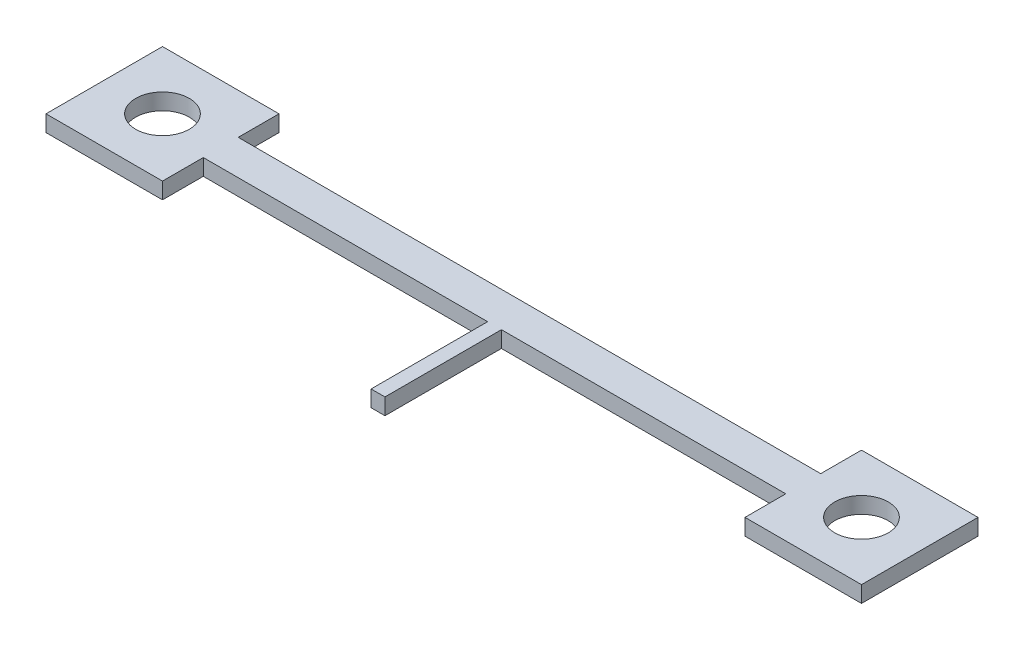
ISO-10303-21;
HEADER;
FILE_DESCRIPTION(('STEP AP214'),'2;1');
FILE_NAME('part.step','',(''),(''),'','','');
FILE_SCHEMA(('AUTOMOTIVE_DESIGN { 1 0 10303 214 1 1 1 1 }'));
ENDSEC;
DATA;
#1=APPLICATION_CONTEXT('core data for automotive mechanical design processes');
#2=APPLICATION_PROTOCOL_DEFINITION('international standard','automotive_design',2000,#1);
#3=PRODUCT_CONTEXT('',#1,'mechanical');
#4=PRODUCT('Part','Part','',(#3));
#5=PRODUCT_RELATED_PRODUCT_CATEGORY('part','',(#4));
#6=PRODUCT_DEFINITION_FORMATION('','',#4);
#7=PRODUCT_DEFINITION_CONTEXT('part definition',#1,'design');
#8=PRODUCT_DEFINITION('design','',#6,#7);
#9=PRODUCT_DEFINITION_SHAPE('','',#8);
#10=(LENGTH_UNIT() NAMED_UNIT(*) SI_UNIT(.MILLI.,.METRE.));
#11=(NAMED_UNIT(*) PLANE_ANGLE_UNIT() SI_UNIT($,.RADIAN.));
#12=(NAMED_UNIT(*) SI_UNIT($,.STERADIAN.) SOLID_ANGLE_UNIT());
#13=UNCERTAINTY_MEASURE_WITH_UNIT(LENGTH_MEASURE(1.E-05),#10,'distance_accuracy_value','');
#14=(GEOMETRIC_REPRESENTATION_CONTEXT(3) GLOBAL_UNCERTAINTY_ASSIGNED_CONTEXT((#13)) GLOBAL_UNIT_ASSIGNED_CONTEXT((#10,
#11,#12)) REPRESENTATION_CONTEXT('',''));
#15=CARTESIAN_POINT('',(0.,0.,0.));
#16=DIRECTION('',(0.,0.,1.));
#17=DIRECTION('',(1.,0.,0.));
#18=AXIS2_PLACEMENT_3D('',#15,#16,#17);
#19=CARTESIAN_POINT('',(-41.4240464845624,0.4445,10.2832594653076));
#20=DIRECTION('',(0.,0.,-1.));
#21=DIRECTION('',(-1.,0.,0.));
#22=AXIS2_PLACEMENT_3D('',#19,#20,#21);
#23=PLANE('',#22);
#24=DIRECTION('',(0.,1.,0.));
#25=VECTOR('',#24,1.);
#26=CARTESIAN_POINT('',(-25.1720464765624,0.4445,10.2832594653076));
#27=LINE('',#26,#25);
#28=CARTESIAN_POINT('',(-25.1720464765624,-0.444499999999999,10.2832594653076));
#29=VERTEX_POINT('',#28);
#30=CARTESIAN_POINT('',(-25.1720464765624,0.4445,10.2832594653076));
#31=VERTEX_POINT('',#30);
#32=EDGE_CURVE('E499',#29,#31,#27,.T.);
#33=ORIENTED_EDGE('',*,*,#32,.F.);
#34=DIRECTION('',(1.,0.,0.));
#35=VECTOR('',#34,1.);
#36=CARTESIAN_POINT('',(-41.4240464845624,-0.4445,10.2832594653076));
#37=LINE('',#36,#35);
#38=CARTESIAN_POINT('',(-9.67404648456241,-0.4445,10.2832594653076));
#39=VERTEX_POINT('',#38);
#40=EDGE_CURVE('E181',#29,#39,#37,.T.);
#41=ORIENTED_EDGE('',*,*,#40,.T.);
#42=DIRECTION('',(0.,-1.,0.));
#43=VECTOR('',#42,1.);
#44=CARTESIAN_POINT('',(-9.67404648456241,0.4445,10.2832594653076));
#45=LINE('',#44,#43);
#46=CARTESIAN_POINT('',(-9.67404648456241,0.4445,10.2832594653076));
#47=VERTEX_POINT('',#46);
#48=EDGE_CURVE('E154',#47,#39,#45,.T.);
#49=ORIENTED_EDGE('',*,*,#48,.F.);
#50=DIRECTION('',(1.,0.,0.));
#51=VECTOR('',#50,1.);
#52=CARTESIAN_POINT('',(-41.4240464845624,0.4445,10.2832594653076));
#53=LINE('',#52,#51);
#54=EDGE_CURVE('E144',#31,#47,#53,.T.);
#55=ORIENTED_EDGE('',*,*,#54,.F.);
#56=EDGE_LOOP('',(#33,#41,#49,#55));
#57=FACE_BOUND('',#56,.T.);
#58=ADVANCED_FACE('F36',(#57),#23,.F.);
#59=CARTESIAN_POINT('',(-41.4240464845624,-0.4445,10.2832594653076));
#60=VERTEX_POINT('',#59);
#61=CARTESIAN_POINT('',(-25.9260464925624,-0.4445,10.2832594653076));
#62=VERTEX_POINT('',#61);
#63=EDGE_CURVE('E182',#60,#62,#37,.T.);
#64=ORIENTED_EDGE('',*,*,#63,.T.);
#65=DIRECTION('',(0.,-1.,0.));
#66=VECTOR('',#65,1.);
#67=CARTESIAN_POINT('',(-25.9260464925624,0.4445,10.2832594653076));
#68=LINE('',#67,#66);
#69=CARTESIAN_POINT('',(-25.9260464925624,0.4445,10.2832594653076));
#70=VERTEX_POINT('',#69);
#71=EDGE_CURVE('E258',#70,#62,#68,.T.);
#72=ORIENTED_EDGE('',*,*,#71,.F.);
#73=CARTESIAN_POINT('',(-41.4240464845624,0.4445,10.2832594653076));
#74=VERTEX_POINT('',#73);
#75=EDGE_CURVE('E148',#74,#70,#53,.T.);
#76=ORIENTED_EDGE('',*,*,#75,.F.);
#77=DIRECTION('',(0.,-1.,0.));
#78=VECTOR('',#77,1.);
#79=CARTESIAN_POINT('',(-41.4240464845624,0.4445,10.2832594653076));
#80=LINE('',#79,#78);
#81=EDGE_CURVE('E192',#74,#60,#80,.T.);
#82=ORIENTED_EDGE('',*,*,#81,.T.);
#83=EDGE_LOOP('',(#64,#72,#76,#82));
#84=FACE_BOUND('',#83,.T.);
#85=ADVANCED_FACE('F255',(#84),#23,.F.);
#86=CARTESIAN_POINT('',(-9.67404648456241,0.4445,6.15575946530759));
#87=DIRECTION('',(0.,0.,1.));
#88=DIRECTION('',(1.,0.,0.));
#89=AXIS2_PLACEMENT_3D('',#86,#87,#88);
#90=PLANE('',#89);
#91=DIRECTION('',(-1.,0.,0.));
#92=VECTOR('',#91,1.);
#93=CARTESIAN_POINT('',(-9.67404648456241,-0.4445,6.15575946530759));
#94=LINE('',#93,#92);
#95=CARTESIAN_POINT('',(-3.32404648456241,-0.4445,6.15575946530759));
#96=VERTEX_POINT('',#95);
#97=CARTESIAN_POINT('',(-9.67404648456241,-0.4445,6.15575946530759));
#98=VERTEX_POINT('',#97);
#99=EDGE_CURVE('E163',#96,#98,#94,.T.);
#100=ORIENTED_EDGE('',*,*,#99,.T.);
#101=DIRECTION('',(0.,-1.,0.));
#102=VECTOR('',#101,1.);
#103=CARTESIAN_POINT('',(-9.67404648456241,0.4445,6.15575946530759));
#104=LINE('',#103,#102);
#105=CARTESIAN_POINT('',(-9.67404648456241,0.4445,6.15575946530759));
#106=VERTEX_POINT('',#105);
#107=EDGE_CURVE('E11',#106,#98,#104,.T.);
#108=ORIENTED_EDGE('',*,*,#107,.F.);
#109=DIRECTION('',(-1.,0.,0.));
#110=VECTOR('',#109,1.);
#111=CARTESIAN_POINT('',(-9.67404648456241,0.4445,6.15575946530759));
#112=LINE('',#111,#110);
#113=CARTESIAN_POINT('',(-3.32404648456241,0.4445,6.15575946530759));
#114=VERTEX_POINT('',#113);
#115=EDGE_CURVE('E188',#114,#106,#112,.T.);
#116=ORIENTED_EDGE('',*,*,#115,.F.);
#117=DIRECTION('',(0.,-1.,0.));
#118=VECTOR('',#117,1.);
#119=CARTESIAN_POINT('',(-3.32404648456241,0.4445,6.15575946530759));
#120=LINE('',#119,#118);
#121=EDGE_CURVE('E159',#114,#96,#120,.T.);
#122=ORIENTED_EDGE('',*,*,#121,.T.);
#123=EDGE_LOOP('',(#100,#108,#116,#122));
#124=FACE_BOUND('',#123,.T.);
#125=ADVANCED_FACE('F38',(#124),#90,.F.);
#126=CARTESIAN_POINT('',(-9.67404648456241,0.4445,8.37825946530759));
#127=DIRECTION('',(1.,0.,0.));
#128=DIRECTION('',(0.,0.,-1.));
#129=AXIS2_PLACEMENT_3D('',#126,#127,#128);
#130=PLANE('',#129);
#131=DIRECTION('',(0.,0.,1.));
#132=VECTOR('',#131,1.);
#133=CARTESIAN_POINT('',(-9.67404648456241,-0.4445,8.37825946530759));
#134=LINE('',#133,#132);
#135=CARTESIAN_POINT('',(-9.67404648456241,-0.4445,8.37825946530759));
#136=VERTEX_POINT('',#135);
#137=EDGE_CURVE('E166',#98,#136,#134,.T.);
#138=ORIENTED_EDGE('',*,*,#137,.T.);
#139=DIRECTION('',(0.,-1.,0.));
#140=VECTOR('',#139,1.);
#141=CARTESIAN_POINT('',(-9.67404648456241,0.4445,8.37825946530759));
#142=LINE('',#141,#140);
#143=CARTESIAN_POINT('',(-9.67404648456241,0.4445,8.37825946530759));
#144=VERTEX_POINT('',#143);
#145=EDGE_CURVE('E45',#144,#136,#142,.T.);
#146=ORIENTED_EDGE('',*,*,#145,.F.);
#147=DIRECTION('',(0.,0.,1.));
#148=VECTOR('',#147,1.);
#149=CARTESIAN_POINT('',(-9.67404648456241,0.4445,8.37825946530759));
#150=LINE('',#149,#148);
#151=EDGE_CURVE('E109',#106,#144,#150,.T.);
#152=ORIENTED_EDGE('',*,*,#151,.F.);
#153=ORIENTED_EDGE('',*,*,#107,.T.);
#154=EDGE_LOOP('',(#138,#146,#152,#153));
#155=FACE_BOUND('',#154,.T.);
#156=ADVANCED_FACE('F296',(#155),#130,.F.);
#157=CARTESIAN_POINT('',(-41.4240464845624,0.4445,8.37825946530759));
#158=DIRECTION('',(0.,0.,1.));
#159=DIRECTION('',(1.,0.,0.));
#160=AXIS2_PLACEMENT_3D('',#157,#158,#159);
#161=PLANE('',#160);
#162=DIRECTION('',(-1.,0.,0.));
#163=VECTOR('',#162,1.);
#164=CARTESIAN_POINT('',(-41.4240464845624,-0.4445,8.37825946530759));
#165=LINE('',#164,#163);
#166=CARTESIAN_POINT('',(-41.4240464845624,-0.4445,8.37825946530759));
#167=VERTEX_POINT('',#166);
#168=EDGE_CURVE('E169',#136,#167,#165,.T.);
#169=ORIENTED_EDGE('',*,*,#168,.T.);
#170=DIRECTION('',(0.,-1.,0.));
#171=VECTOR('',#170,1.);
#172=CARTESIAN_POINT('',(-41.4240464845624,0.4445,8.37825946530759));
#173=LINE('',#172,#171);
#174=CARTESIAN_POINT('',(-41.4240464845624,0.4445,8.37825946530759));
#175=VERTEX_POINT('',#174);
#176=EDGE_CURVE('E207',#175,#167,#173,.T.);
#177=ORIENTED_EDGE('',*,*,#176,.F.);
#178=DIRECTION('',(-1.,0.,0.));
#179=VECTOR('',#178,1.);
#180=CARTESIAN_POINT('',(-41.4240464845624,0.4445,8.37825946530759));
#181=LINE('',#180,#179);
#182=EDGE_CURVE('E215',#144,#175,#181,.T.);
#183=ORIENTED_EDGE('',*,*,#182,.F.);
#184=ORIENTED_EDGE('',*,*,#145,.T.);
#185=EDGE_LOOP('',(#169,#177,#183,#184));
#186=FACE_BOUND('',#185,.T.);
#187=ADVANCED_FACE('F213',(#186),#161,.F.);
#188=CARTESIAN_POINT('',(-41.4240464845624,0.4445,8.37825946530759));
#189=DIRECTION('',(-1.,0.,0.));
#190=DIRECTION('',(0.,0.,1.));
#191=AXIS2_PLACEMENT_3D('',#188,#189,#190);
#192=PLANE('',#191);
#193=DIRECTION('',(0.,0.,-1.));
#194=VECTOR('',#193,1.);
#195=CARTESIAN_POINT('',(-41.4240464845624,-0.4445,8.37825946530759));
#196=LINE('',#195,#194);
#197=CARTESIAN_POINT('',(-41.4240464845624,-0.4445,6.15575946530758));
#198=VERTEX_POINT('',#197);
#199=EDGE_CURVE('E171',#167,#198,#196,.T.);
#200=ORIENTED_EDGE('',*,*,#199,.T.);
#201=DIRECTION('',(0.,-1.,0.));
#202=VECTOR('',#201,1.);
#203=CARTESIAN_POINT('',(-41.4240464845624,0.4445,6.15575946530758));
#204=LINE('',#203,#202);
#205=CARTESIAN_POINT('',(-41.4240464845624,0.4445,6.15575946530758));
#206=VERTEX_POINT('',#205);
#207=EDGE_CURVE('E204',#206,#198,#204,.T.);
#208=ORIENTED_EDGE('',*,*,#207,.F.);
#209=DIRECTION('',(0.,0.,-1.));
#210=VECTOR('',#209,1.);
#211=CARTESIAN_POINT('',(-41.4240464845624,0.4445,8.37825946530759));
#212=LINE('',#211,#210);
#213=EDGE_CURVE('E235',#175,#206,#212,.T.);
#214=ORIENTED_EDGE('',*,*,#213,.F.);
#215=ORIENTED_EDGE('',*,*,#176,.T.);
#216=EDGE_LOOP('',(#200,#208,#214,#215));
#217=FACE_BOUND('',#216,.T.);
#218=ADVANCED_FACE('F226',(#217),#192,.F.);
#219=CARTESIAN_POINT('',(-47.7740464845624,0.4445,6.15575946530758));
#220=DIRECTION('',(0.,0.,1.));
#221=DIRECTION('',(1.,0.,0.));
#222=AXIS2_PLACEMENT_3D('',#219,#220,#221);
#223=PLANE('',#222);
#224=DIRECTION('',(-1.,0.,0.));
#225=VECTOR('',#224,1.);
#226=CARTESIAN_POINT('',(-47.7740464845624,-0.4445,6.15575946530758));
#227=LINE('',#226,#225);
#228=CARTESIAN_POINT('',(-47.7740464845624,-0.4445,6.15575946530758));
#229=VERTEX_POINT('',#228);
#230=EDGE_CURVE('E173',#198,#229,#227,.T.);
#231=ORIENTED_EDGE('',*,*,#230,.T.);
#232=DIRECTION('',(0.,-1.,0.));
#233=VECTOR('',#232,1.);
#234=CARTESIAN_POINT('',(-47.7740464845624,0.4445,6.15575946530758));
#235=LINE('',#234,#233);
#236=CARTESIAN_POINT('',(-47.7740464845624,0.4445,6.15575946530758));
#237=VERTEX_POINT('',#236);
#238=EDGE_CURVE('E201',#237,#229,#235,.T.);
#239=ORIENTED_EDGE('',*,*,#238,.F.);
#240=DIRECTION('',(-1.,0.,0.));
#241=VECTOR('',#240,1.);
#242=CARTESIAN_POINT('',(-47.7740464845624,0.4445,6.15575946530758));
#243=LINE('',#242,#241);
#244=EDGE_CURVE('E232',#206,#237,#243,.T.);
#245=ORIENTED_EDGE('',*,*,#244,.F.);
#246=ORIENTED_EDGE('',*,*,#207,.T.);
#247=EDGE_LOOP('',(#231,#239,#245,#246));
#248=FACE_BOUND('',#247,.T.);
#249=ADVANCED_FACE('F230',(#248),#223,.F.);
#250=CARTESIAN_POINT('',(-47.7740464845624,0.4445,12.5057594653076));
#251=DIRECTION('',(1.,0.,0.));
#252=DIRECTION('',(0.,0.,-1.));
#253=AXIS2_PLACEMENT_3D('',#250,#251,#252);
#254=PLANE('',#253);
#255=DIRECTION('',(0.,0.,1.));
#256=VECTOR('',#255,1.);
#257=CARTESIAN_POINT('',(-47.7740464845624,-0.4445,12.5057594653076));
#258=LINE('',#257,#256);
#259=CARTESIAN_POINT('',(-47.7740464845624,-0.4445,12.5057594653076));
#260=VERTEX_POINT('',#259);
#261=EDGE_CURVE('E175',#229,#260,#258,.T.);
#262=ORIENTED_EDGE('',*,*,#261,.T.);
#263=DIRECTION('',(0.,-1.,0.));
#264=VECTOR('',#263,1.);
#265=CARTESIAN_POINT('',(-47.7740464845624,0.4445,12.5057594653076));
#266=LINE('',#265,#264);
#267=CARTESIAN_POINT('',(-47.7740464845624,0.4445,12.5057594653076));
#268=VERTEX_POINT('',#267);
#269=EDGE_CURVE('E198',#268,#260,#266,.T.);
#270=ORIENTED_EDGE('',*,*,#269,.F.);
#271=DIRECTION('',(0.,0.,1.));
#272=VECTOR('',#271,1.);
#273=CARTESIAN_POINT('',(-47.7740464845624,0.4445,12.5057594653076));
#274=LINE('',#273,#272);
#275=EDGE_CURVE('E234',#237,#268,#274,.T.);
#276=ORIENTED_EDGE('',*,*,#275,.F.);
#277=ORIENTED_EDGE('',*,*,#238,.T.);
#278=EDGE_LOOP('',(#262,#270,#276,#277));
#279=FACE_BOUND('',#278,.T.);
#280=ADVANCED_FACE('F320',(#279),#254,.F.);
#281=CARTESIAN_POINT('',(-47.7740464845624,0.4445,12.5057594653076));
#282=DIRECTION('',(0.,0.,-1.));
#283=DIRECTION('',(-1.,0.,0.));
#284=AXIS2_PLACEMENT_3D('',#281,#282,#283);
#285=PLANE('',#284);
#286=DIRECTION('',(1.,0.,0.));
#287=VECTOR('',#286,1.);
#288=CARTESIAN_POINT('',(-47.7740464845624,-0.4445,12.5057594653076));
#289=LINE('',#288,#287);
#290=CARTESIAN_POINT('',(-41.4240464845624,-0.4445,12.5057594653076));
#291=VERTEX_POINT('',#290);
#292=EDGE_CURVE('E177',#260,#291,#289,.T.);
#293=ORIENTED_EDGE('',*,*,#292,.T.);
#294=DIRECTION('',(0.,-1.,0.));
#295=VECTOR('',#294,1.);
#296=CARTESIAN_POINT('',(-41.4240464845624,0.4445,12.5057594653076));
#297=LINE('',#296,#295);
#298=CARTESIAN_POINT('',(-41.4240464845624,0.4445,12.5057594653076));
#299=VERTEX_POINT('',#298);
#300=EDGE_CURVE('E195',#299,#291,#297,.T.);
#301=ORIENTED_EDGE('',*,*,#300,.F.);
#302=DIRECTION('',(1.,0.,0.));
#303=VECTOR('',#302,1.);
#304=CARTESIAN_POINT('',(-47.7740464845624,0.4445,12.5057594653076));
#305=LINE('',#304,#303);
#306=EDGE_CURVE('E237',#268,#299,#305,.T.);
#307=ORIENTED_EDGE('',*,*,#306,.F.);
#308=ORIENTED_EDGE('',*,*,#269,.T.);
#309=EDGE_LOOP('',(#293,#301,#307,#308));
#310=FACE_BOUND('',#309,.T.);
#311=ADVANCED_FACE('F316',(#310),#285,.F.);
#312=CARTESIAN_POINT('',(-41.4240464845624,0.4445,10.2832594653076));
#313=DIRECTION('',(-1.,0.,0.));
#314=DIRECTION('',(0.,0.,1.));
#315=AXIS2_PLACEMENT_3D('',#312,#313,#314);
#316=PLANE('',#315);
#317=DIRECTION('',(0.,0.,-1.));
#318=VECTOR('',#317,1.);
#319=CARTESIAN_POINT('',(-41.4240464845624,-0.4445,10.2832594653076));
#320=LINE('',#319,#318);
#321=EDGE_CURVE('E179',#291,#60,#320,.T.);
#322=ORIENTED_EDGE('',*,*,#321,.T.);
#323=ORIENTED_EDGE('',*,*,#81,.F.);
#324=DIRECTION('',(0.,0.,-1.));
#325=VECTOR('',#324,1.);
#326=CARTESIAN_POINT('',(-41.4240464845624,0.4445,10.2832594653076));
#327=LINE('',#326,#325);
#328=EDGE_CURVE('E243',#299,#74,#327,.T.);
#329=ORIENTED_EDGE('',*,*,#328,.F.);
#330=ORIENTED_EDGE('',*,*,#300,.T.);
#331=EDGE_LOOP('',(#322,#323,#329,#330));
#332=FACE_BOUND('',#331,.T.);
#333=ADVANCED_FACE('F313',(#332),#316,.F.);
#334=CARTESIAN_POINT('',(-9.67404648456241,0.4445,10.2832594653076));
#335=DIRECTION('',(1.,0.,0.));
#336=DIRECTION('',(0.,0.,-1.));
#337=AXIS2_PLACEMENT_3D('',#334,#335,#336);
#338=PLANE('',#337);
#339=DIRECTION('',(0.,0.,1.));
#340=VECTOR('',#339,1.);
#341=CARTESIAN_POINT('',(-9.67404648456241,-0.4445,10.2832594653076));
#342=LINE('',#341,#340);
#343=CARTESIAN_POINT('',(-9.67404648456241,-0.4445,12.5057594653076));
#344=VERTEX_POINT('',#343);
#345=EDGE_CURVE('E153',#39,#344,#342,.T.);
#346=ORIENTED_EDGE('',*,*,#345,.T.);
#347=DIRECTION('',(0.,-1.,0.));
#348=VECTOR('',#347,1.);
#349=CARTESIAN_POINT('',(-9.67404648456241,0.4445,12.5057594653076));
#350=LINE('',#349,#348);
#351=CARTESIAN_POINT('',(-9.67404648456241,0.4445,12.5057594653076));
#352=VERTEX_POINT('',#351);
#353=EDGE_CURVE('E150',#352,#344,#350,.T.);
#354=ORIENTED_EDGE('',*,*,#353,.F.);
#355=DIRECTION('',(0.,0.,1.));
#356=VECTOR('',#355,1.);
#357=CARTESIAN_POINT('',(-9.67404648456241,0.4445,10.2832594653076));
#358=LINE('',#357,#356);
#359=EDGE_CURVE('E136',#47,#352,#358,.T.);
#360=ORIENTED_EDGE('',*,*,#359,.F.);
#361=ORIENTED_EDGE('',*,*,#48,.T.);
#362=EDGE_LOOP('',(#346,#354,#360,#361));
#363=FACE_BOUND('',#362,.T.);
#364=ADVANCED_FACE('F151',(#363),#338,.F.);
#365=CARTESIAN_POINT('',(-9.67404648456241,0.4445,12.5057594653076));
#366=DIRECTION('',(0.,0.,-1.));
#367=DIRECTION('',(-1.,0.,0.));
#368=AXIS2_PLACEMENT_3D('',#365,#366,#367);
#369=PLANE('',#368);
#370=DIRECTION('',(1.,0.,0.));
#371=VECTOR('',#370,1.);
#372=CARTESIAN_POINT('',(-9.67404648456241,-0.4445,12.5057594653076));
#373=LINE('',#372,#371);
#374=CARTESIAN_POINT('',(-3.32404648456241,-0.4445,12.5057594653076));
#375=VERTEX_POINT('',#374);
#376=EDGE_CURVE('E95',#344,#375,#373,.T.);
#377=ORIENTED_EDGE('',*,*,#376,.T.);
#378=DIRECTION('',(0.,-1.,0.));
#379=VECTOR('',#378,1.);
#380=CARTESIAN_POINT('',(-3.32404648456241,0.4445,12.5057594653076));
#381=LINE('',#380,#379);
#382=CARTESIAN_POINT('',(-3.32404648456241,0.4445,12.5057594653076));
#383=VERTEX_POINT('',#382);
#384=EDGE_CURVE('E155',#383,#375,#381,.T.);
#385=ORIENTED_EDGE('',*,*,#384,.F.);
#386=DIRECTION('',(1.,0.,0.));
#387=VECTOR('',#386,1.);
#388=CARTESIAN_POINT('',(-9.67404648456241,0.4445,12.5057594653076));
#389=LINE('',#388,#387);
#390=EDGE_CURVE('E142',#352,#383,#389,.T.);
#391=ORIENTED_EDGE('',*,*,#390,.F.);
#392=ORIENTED_EDGE('',*,*,#353,.T.);
#393=EDGE_LOOP('',(#377,#385,#391,#392));
#394=FACE_BOUND('',#393,.T.);
#395=ADVANCED_FACE('F157',(#394),#369,.F.);
#396=CARTESIAN_POINT('',(-3.32404648456241,0.4445,12.5057594653076));
#397=DIRECTION('',(-1.,0.,0.));
#398=DIRECTION('',(0.,0.,1.));
#399=AXIS2_PLACEMENT_3D('',#396,#397,#398);
#400=PLANE('',#399);
#401=DIRECTION('',(0.,0.,-1.));
#402=VECTOR('',#401,1.);
#403=CARTESIAN_POINT('',(-3.32404648456241,-0.4445,12.5057594653076));
#404=LINE('',#403,#402);
#405=EDGE_CURVE('E101',#375,#96,#404,.T.);
#406=ORIENTED_EDGE('',*,*,#405,.T.);
#407=ORIENTED_EDGE('',*,*,#121,.F.);
#408=DIRECTION('',(0.,0.,-1.));
#409=VECTOR('',#408,1.);
#410=CARTESIAN_POINT('',(-3.32404648456241,0.4445,12.5057594653076));
#411=LINE('',#410,#409);
#412=EDGE_CURVE('E53',#383,#114,#411,.T.);
#413=ORIENTED_EDGE('',*,*,#412,.F.);
#414=ORIENTED_EDGE('',*,*,#384,.T.);
#415=EDGE_LOOP('',(#406,#407,#413,#414));
#416=FACE_BOUND('',#415,.T.);
#417=ADVANCED_FACE('F359',(#416),#400,.F.);
#418=CARTESIAN_POINT('',(-3.32404648456241,0.4445,6.15575946530759));
#419=DIRECTION('',(0.,1.,0.));
#420=DIRECTION('',(0.,0.,1.));
#421=AXIS2_PLACEMENT_3D('',#418,#419,#420);
#422=PLANE('',#421);
#423=DIRECTION('',(0.,0.,1.));
#424=VECTOR('',#423,1.);
#425=CARTESIAN_POINT('',(-25.1720464765624,0.4445,10.2832594653076));
#426=LINE('',#425,#424);
#427=CARTESIAN_POINT('',(-25.1720464765624,0.444499999999999,16.6332594653076));
#428=VERTEX_POINT('',#427);
#429=EDGE_CURVE('E502',#31,#428,#426,.T.);
#430=ORIENTED_EDGE('',*,*,#429,.F.);
#431=ORIENTED_EDGE('',*,*,#54,.T.);
#432=ORIENTED_EDGE('',*,*,#359,.T.);
#433=ORIENTED_EDGE('',*,*,#390,.T.);
#434=ORIENTED_EDGE('',*,*,#412,.T.);
#435=ORIENTED_EDGE('',*,*,#115,.T.);
#436=ORIENTED_EDGE('',*,*,#151,.T.);
#437=ORIENTED_EDGE('',*,*,#182,.T.);
#438=ORIENTED_EDGE('',*,*,#213,.T.);
#439=ORIENTED_EDGE('',*,*,#244,.T.);
#440=ORIENTED_EDGE('',*,*,#275,.T.);
#441=ORIENTED_EDGE('',*,*,#306,.T.);
#442=ORIENTED_EDGE('',*,*,#328,.T.);
#443=ORIENTED_EDGE('',*,*,#75,.T.);
#444=DIRECTION('',(0.,0.,-1.));
#445=VECTOR('',#444,1.);
#446=CARTESIAN_POINT('',(-25.9260464925624,0.4445,10.2832594653076));
#447=LINE('',#446,#445);
#448=CARTESIAN_POINT('',(-25.9260464925624,0.4445,16.6332594653076));
#449=VERTEX_POINT('',#448);
#450=EDGE_CURVE('E250',#449,#70,#447,.T.);
#451=ORIENTED_EDGE('',*,*,#450,.F.);
#452=DIRECTION('',(-1.,0.,0.));
#453=VECTOR('',#452,1.);
#454=CARTESIAN_POINT('',(-25.7990464925624,0.4445,16.6332594653076));
#455=LINE('',#454,#453);
#456=EDGE_CURVE('E278',#428,#449,#455,.T.);
#457=ORIENTED_EDGE('',*,*,#456,.F.);
#458=EDGE_LOOP('',(#430,#431,#432,#433,#434,#435,#436,#437,#438,#439,#440,#441,#442,#443,#451,#457));
#459=FACE_BOUND('',#458,.T.);
#460=CARTESIAN_POINT('',(-6.49904648456241,0.4445,9.33075946530758));
#461=DIRECTION('',(0.,1.,0.));
#462=DIRECTION('',(0.,0.,1.));
#463=AXIS2_PLACEMENT_3D('',#460,#461,#462);
#464=CIRCLE('',#463,1.4605);
#465=CARTESIAN_POINT('',(-6.49904648456241,0.4445,10.7912594653076));
#466=VERTEX_POINT('',#465);
#467=EDGE_CURVE('E281',#466,#466,#464,.T.);
#468=ORIENTED_EDGE('',*,*,#467,.F.);
#469=EDGE_LOOP('',(#468));
#470=FACE_BOUND('',#469,.T.);
#471=CARTESIAN_POINT('',(-44.5990464845624,0.4445,9.33075946530758));
#472=DIRECTION('',(0.,1.,0.));
#473=DIRECTION('',(0.,0.,1.));
#474=AXIS2_PLACEMENT_3D('',#471,#472,#473);
#475=CIRCLE('',#474,1.4605);
#476=CARTESIAN_POINT('',(-44.5990464845624,0.4445,10.7912594653076));
#477=VERTEX_POINT('',#476);
#478=EDGE_CURVE('E287',#477,#477,#475,.T.);
#479=ORIENTED_EDGE('',*,*,#478,.F.);
#480=EDGE_LOOP('',(#479));
#481=FACE_BOUND('',#480,.T.);
#482=ADVANCED_FACE('F139',(#459,#470,#481),#422,.T.);
#483=CARTESIAN_POINT('',(-3.32404648456241,-0.4445,6.15575946530759));
#484=DIRECTION('',(0.,1.,0.));
#485=DIRECTION('',(0.,0.,1.));
#486=AXIS2_PLACEMENT_3D('',#483,#484,#485);
#487=PLANE('',#486);
#488=ORIENTED_EDGE('',*,*,#40,.F.);
#489=DIRECTION('',(0.,0.,-1.));
#490=VECTOR('',#489,1.);
#491=CARTESIAN_POINT('',(-25.1720464765624,-0.444499999999999,10.2832594653076));
#492=LINE('',#491,#490);
#493=CARTESIAN_POINT('',(-25.1720464765624,-0.4445,16.6332594653076));
#494=VERTEX_POINT('',#493);
#495=EDGE_CURVE('E263',#494,#29,#492,.T.);
#496=ORIENTED_EDGE('',*,*,#495,.F.);
#497=DIRECTION('',(1.,0.,0.));
#498=VECTOR('',#497,1.);
#499=CARTESIAN_POINT('',(-25.2990464765624,-0.4445,16.6332594653076));
#500=LINE('',#499,#498);
#501=CARTESIAN_POINT('',(-25.9260464925624,-0.4445,16.6332594653076));
#502=VERTEX_POINT('',#501);
#503=EDGE_CURVE('E275',#502,#494,#500,.T.);
#504=ORIENTED_EDGE('',*,*,#503,.F.);
#505=DIRECTION('',(0.,0.,1.));
#506=VECTOR('',#505,1.);
#507=CARTESIAN_POINT('',(-25.9260464925624,-0.4445,10.2832594653076));
#508=LINE('',#507,#506);
#509=EDGE_CURVE('E262',#62,#502,#508,.T.);
#510=ORIENTED_EDGE('',*,*,#509,.F.);
#511=ORIENTED_EDGE('',*,*,#63,.F.);
#512=ORIENTED_EDGE('',*,*,#321,.F.);
#513=ORIENTED_EDGE('',*,*,#292,.F.);
#514=ORIENTED_EDGE('',*,*,#261,.F.);
#515=ORIENTED_EDGE('',*,*,#230,.F.);
#516=ORIENTED_EDGE('',*,*,#199,.F.);
#517=ORIENTED_EDGE('',*,*,#168,.F.);
#518=ORIENTED_EDGE('',*,*,#137,.F.);
#519=ORIENTED_EDGE('',*,*,#99,.F.);
#520=ORIENTED_EDGE('',*,*,#405,.F.);
#521=ORIENTED_EDGE('',*,*,#376,.F.);
#522=ORIENTED_EDGE('',*,*,#345,.F.);
#523=EDGE_LOOP('',(#488,#496,#504,#510,#511,#512,#513,#514,#515,#516,#517,#518,#519,#520,#521,#522));
#524=FACE_BOUND('',#523,.T.);
#525=CARTESIAN_POINT('',(-6.49904648456241,-0.4445,9.33075946530758));
#526=DIRECTION('',(0.,1.,0.));
#527=DIRECTION('',(0.,0.,1.));
#528=AXIS2_PLACEMENT_3D('',#525,#526,#527);
#529=CIRCLE('',#528,1.4605);
#530=CARTESIAN_POINT('',(-6.49904648456241,-0.4445,10.7912594653076));
#531=VERTEX_POINT('',#530);
#532=EDGE_CURVE('E284',#531,#531,#529,.T.);
#533=ORIENTED_EDGE('',*,*,#532,.T.);
#534=EDGE_LOOP('',(#533));
#535=FACE_BOUND('',#534,.T.);
#536=CARTESIAN_POINT('',(-44.5990464845624,-0.4445,9.33075946530758));
#537=DIRECTION('',(0.,1.,0.));
#538=DIRECTION('',(0.,0.,1.));
#539=AXIS2_PLACEMENT_3D('',#536,#537,#538);
#540=CIRCLE('',#539,1.4605);
#541=CARTESIAN_POINT('',(-44.5990464845624,-0.4445,10.7912594653076));
#542=VERTEX_POINT('',#541);
#543=EDGE_CURVE('E167',#542,#542,#540,.T.);
#544=ORIENTED_EDGE('',*,*,#543,.T.);
#545=EDGE_LOOP('',(#544));
#546=FACE_BOUND('',#545,.T.);
#547=ADVANCED_FACE('F219',(#524,#535,#546),#487,.F.);
#548=CARTESIAN_POINT('',(-44.5990464845624,0.4445,9.33075946530758));
#549=DIRECTION('',(0.,1.,0.));
#550=DIRECTION('',(0.,0.,1.));
#551=AXIS2_PLACEMENT_3D('',#548,#549,#550);
#552=CYLINDRICAL_SURFACE('',#551,1.4605);
#553=ORIENTED_EDGE('',*,*,#543,.F.);
#554=EDGE_LOOP('',(#553));
#555=FACE_BOUND('',#554,.T.);
#556=ORIENTED_EDGE('',*,*,#478,.T.);
#557=EDGE_LOOP('',(#556));
#558=FACE_BOUND('',#557,.T.);
#559=ADVANCED_FACE('F378',(#555,#558),#552,.F.);
#560=CARTESIAN_POINT('',(-6.49904648456241,0.4445,9.33075946530758));
#561=DIRECTION('',(0.,1.,0.));
#562=DIRECTION('',(0.,0.,1.));
#563=AXIS2_PLACEMENT_3D('',#560,#561,#562);
#564=CYLINDRICAL_SURFACE('',#563,1.4605);
#565=ORIENTED_EDGE('',*,*,#532,.F.);
#566=EDGE_LOOP('',(#565));
#567=FACE_BOUND('',#566,.T.);
#568=ORIENTED_EDGE('',*,*,#467,.T.);
#569=EDGE_LOOP('',(#568));
#570=FACE_BOUND('',#569,.T.);
#571=ADVANCED_FACE('F385',(#567,#570),#564,.F.);
#572=CARTESIAN_POINT('',(0.,0.,16.6332594653076));
#573=DIRECTION('',(0.,0.,-1.));
#574=DIRECTION('',(-1.,0.,0.));
#575=AXIS2_PLACEMENT_3D('',#572,#573,#574);
#576=PLANE('',#575);
#577=ORIENTED_EDGE('',*,*,#456,.T.);
#578=DIRECTION('',(0.,1.,0.));
#579=VECTOR('',#578,1.);
#580=CARTESIAN_POINT('',(-25.9260464925624,0.4445,16.6332594653076));
#581=LINE('',#580,#579);
#582=EDGE_CURVE('E265',#502,#449,#581,.T.);
#583=ORIENTED_EDGE('',*,*,#582,.F.);
#584=ORIENTED_EDGE('',*,*,#503,.T.);
#585=DIRECTION('',(0.,-1.,0.));
#586=VECTOR('',#585,1.);
#587=CARTESIAN_POINT('',(-25.1720464765624,0.444499999999999,16.6332594653076));
#588=LINE('',#587,#586);
#589=EDGE_CURVE('E268',#428,#494,#588,.T.);
#590=ORIENTED_EDGE('',*,*,#589,.F.);
#591=EDGE_LOOP('',(#577,#583,#584,#590));
#592=FACE_BOUND('',#591,.T.);
#593=ADVANCED_FACE('F393',(#592),#576,.F.);
#594=CARTESIAN_POINT('',(-25.9260464925624,0.,0.));
#595=DIRECTION('',(-1.,0.,0.));
#596=DIRECTION('',(0.,0.,1.));
#597=AXIS2_PLACEMENT_3D('',#594,#595,#596);
#598=PLANE('',#597);
#599=ORIENTED_EDGE('',*,*,#71,.T.);
#600=ORIENTED_EDGE('',*,*,#509,.T.);
#601=ORIENTED_EDGE('',*,*,#582,.T.);
#602=ORIENTED_EDGE('',*,*,#450,.T.);
#603=EDGE_LOOP('',(#599,#600,#601,#602));
#604=FACE_BOUND('',#603,.T.);
#605=ADVANCED_FACE('F401',(#604),#598,.T.);
#606=CARTESIAN_POINT('',(-25.1720464765624,0.,0.));
#607=DIRECTION('',(-1.,0.,0.));
#608=DIRECTION('',(0.,0.,1.));
#609=AXIS2_PLACEMENT_3D('',#606,#607,#608);
#610=PLANE('',#609);
#611=ORIENTED_EDGE('',*,*,#32,.T.);
#612=ORIENTED_EDGE('',*,*,#429,.T.);
#613=ORIENTED_EDGE('',*,*,#589,.T.);
#614=ORIENTED_EDGE('',*,*,#495,.T.);
#615=EDGE_LOOP('',(#611,#612,#613,#614));
#616=FACE_BOUND('',#615,.T.);
#617=ADVANCED_FACE('F410',(#616),#610,.F.);
#618=CLOSED_SHELL('',(#58,#85,#125,#156,#187,#218,#249,#280,#311,#333,#364,#395,#417,#482,#547,
#559,#571,#593,#605,#617));
#619=MANIFOLD_SOLID_BREP('B2',#618);
#620=ADVANCED_BREP_SHAPE_REPRESENTATION('',(#18,#619),#14);
#621=SHAPE_DEFINITION_REPRESENTATION(#9,#620);
ENDSEC;
END-ISO-10303-21;
